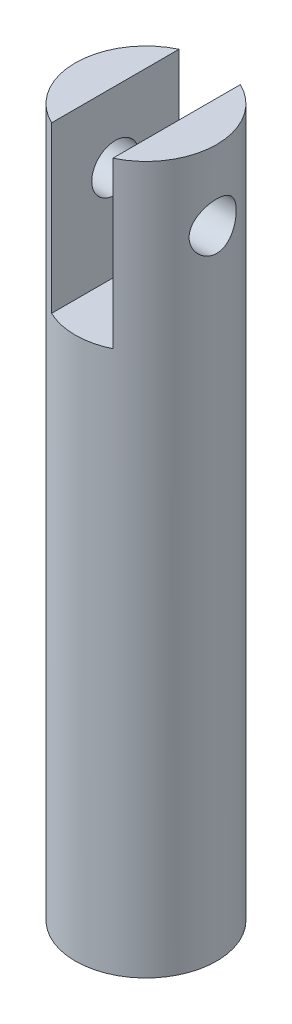
ISO-10303-21;
HEADER;
FILE_DESCRIPTION(('STEP AP214'),'2;1');
FILE_NAME('part.step','',(''),(''),'','','');
FILE_SCHEMA(('AUTOMOTIVE_DESIGN { 1 0 10303 214 1 1 1 1 }'));
ENDSEC;
DATA;
#1=APPLICATION_CONTEXT('core data for automotive mechanical design processes');
#2=APPLICATION_PROTOCOL_DEFINITION('international standard','automotive_design',2000,#1);
#3=PRODUCT_CONTEXT('',#1,'mechanical');
#4=PRODUCT('Part','Part','',(#3));
#5=PRODUCT_RELATED_PRODUCT_CATEGORY('part','',(#4));
#6=PRODUCT_DEFINITION_FORMATION('','',#4);
#7=PRODUCT_DEFINITION_CONTEXT('part definition',#1,'design');
#8=PRODUCT_DEFINITION('design','',#6,#7);
#9=PRODUCT_DEFINITION_SHAPE('','',#8);
#10=(LENGTH_UNIT() NAMED_UNIT(*) SI_UNIT(.MILLI.,.METRE.));
#11=(NAMED_UNIT(*) PLANE_ANGLE_UNIT() SI_UNIT($,.RADIAN.));
#12=(NAMED_UNIT(*) SI_UNIT($,.STERADIAN.) SOLID_ANGLE_UNIT());
#13=UNCERTAINTY_MEASURE_WITH_UNIT(LENGTH_MEASURE(1.E-05),#10,'distance_accuracy_value','');
#14=(GEOMETRIC_REPRESENTATION_CONTEXT(3) GLOBAL_UNCERTAINTY_ASSIGNED_CONTEXT((#13)) GLOBAL_UNIT_ASSIGNED_CONTEXT((#10,
#11,#12)) REPRESENTATION_CONTEXT('',''));
#15=CARTESIAN_POINT('',(0.,0.,0.));
#16=DIRECTION('',(0.,0.,1.));
#17=DIRECTION('',(1.,0.,0.));
#18=AXIS2_PLACEMENT_3D('',#15,#16,#17);
#19=CARTESIAN_POINT('',(0.,30.,0.));
#20=DIRECTION('',(0.,1.,0.));
#21=DIRECTION('',(0.,0.,1.));
#22=AXIS2_PLACEMENT_3D('',#19,#20,#21);
#23=PLANE('',#22);
#24=DIRECTION('',(0.,0.,-1.));
#25=VECTOR('',#24,1.);
#26=CARTESIAN_POINT('',(1.3,30.,0.));
#27=LINE('',#26,#25);
#28=CARTESIAN_POINT('',(1.3,30.,2.70370116691916));
#29=VERTEX_POINT('',#28);
#30=CARTESIAN_POINT('',(1.3,30.,-2.70370116691916));
#31=VERTEX_POINT('',#30);
#32=EDGE_CURVE('E91',#29,#31,#27,.T.);
#33=ORIENTED_EDGE('',*,*,#32,.F.);
#34=CARTESIAN_POINT('',(0.,30.,0.));
#35=DIRECTION('',(0.,1.,0.));
#36=DIRECTION('',(0.,0.,1.));
#37=AXIS2_PLACEMENT_3D('',#34,#35,#36);
#38=CIRCLE('',#37,3.);
#39=EDGE_CURVE('E92',#29,#31,#38,.T.);
#40=ORIENTED_EDGE('',*,*,#39,.T.);
#41=EDGE_LOOP('',(#33,#40));
#42=FACE_BOUND('',#41,.T.);
#43=ADVANCED_FACE('F39',(#42),#23,.T.);
#44=CARTESIAN_POINT('',(0.,30.,0.));
#45=DIRECTION('',(0.,-1.,0.));
#46=DIRECTION('',(0.,0.,-1.));
#47=AXIS2_PLACEMENT_3D('',#44,#45,#46);
#48=CYLINDRICAL_SURFACE('',#47,3.);
#49=CARTESIAN_POINT('',(3.,26.,0.));
#50=CARTESIAN_POINT('',(3.00000015300943,25.9999997462684,0.0545633628867233));
#51=CARTESIAN_POINT('',(2.99849769507545,26.0044802661272,0.10912519453855));
#52=CARTESIAN_POINT('',(2.99265210203281,26.0222291088172,0.216641760872972));
#53=CARTESIAN_POINT('',(2.98830867202153,26.0354983439489,0.269596328118818));
#54=CARTESIAN_POINT('',(2.97725307906443,26.0703192433841,0.372332789501777));
#55=CARTESIAN_POINT('',(2.97054487730853,26.0918570624593,0.422119825886036));
#56=CARTESIAN_POINT('',(2.95544445717342,26.1425411728383,0.517374936805327));
#57=CARTESIAN_POINT('',(2.94705190667778,26.1716889650026,0.562842156958708));
#58=CARTESIAN_POINT('',(2.92914094443005,26.2378258048588,0.649741675022268));
#59=CARTESIAN_POINT('',(2.91959556463785,26.2750312342605,0.691003700298311));
#60=CARTESIAN_POINT('',(2.90060314783121,26.3557671547066,0.766832692702085));
#61=CARTESIAN_POINT('',(2.89115613290549,26.3992990349285,0.801398185489463));
#62=CARTESIAN_POINT('',(2.87313332477274,26.4929851151965,0.86382494222786));
#63=CARTESIAN_POINT('',(2.86459039275688,26.5432937397321,0.891464858221033));
#64=CARTESIAN_POINT('',(2.84975305418601,26.6481760944585,0.937818873877722));
#65=CARTESIAN_POINT('',(2.84345796160746,26.7027485171627,0.956535697386766));
#66=CARTESIAN_POINT('',(2.83411303269377,26.8126732214967,0.983873461509164));
#67=CARTESIAN_POINT('',(2.83096095769611,26.8679372084891,0.992813448271769));
#68=CARTESIAN_POINT('',(2.82795656629508,26.9792637541559,1.00134112333448));
#69=CARTESIAN_POINT('',(2.8281032302273,27.0353260607092,1.00093170160472));
#70=CARTESIAN_POINT('',(2.8315901500818,27.143936630444,0.991019903703419));
#71=CARTESIAN_POINT('',(2.83478415867533,27.196528402919,0.981933913166994));
#72=CARTESIAN_POINT('',(2.84376657724551,27.2993934196068,0.955606162849416));
#73=CARTESIAN_POINT('',(2.84955529784108,27.3496663854351,0.93836342659187));
#74=CARTESIAN_POINT('',(2.86317911131249,27.4474127495915,0.89593905806021));
#75=CARTESIAN_POINT('',(2.87104565793117,27.4948280254695,0.870634048707261));
#76=CARTESIAN_POINT('',(2.88792558575726,27.5848709082797,0.812889106303137));
#77=CARTESIAN_POINT('',(2.89693929790464,27.6274971269334,0.780447112364003));
#78=CARTESIAN_POINT('',(2.91567329167741,27.7090915981608,0.707349332682236));
#79=CARTESIAN_POINT('',(2.92540589354843,27.7477526945091,0.666353150076311));
#80=CARTESIAN_POINT('',(2.94406938387037,27.8177312666634,0.578339569970065));
#81=CARTESIAN_POINT('',(2.95300019538067,27.8490480381645,0.531321595660815));
#82=CARTESIAN_POINT('',(2.96917107937794,27.9036963002351,0.431947613046267));
#83=CARTESIAN_POINT('',(2.9763935000804,27.9269454913407,0.379543276416336));
#84=CARTESIAN_POINT('',(2.98820567144435,27.9642031739557,0.271269083364506));
#85=CARTESIAN_POINT('',(2.99279633654879,27.9782148754234,0.215400438154952));
#86=CARTESIAN_POINT('',(2.99867627071441,27.9960556660224,0.104383829529301));
#87=CARTESIAN_POINT('',(3.00010001833731,28.0002998091727,0.0493095998648431));
#88=CARTESIAN_POINT('',(2.99988902694825,27.9996673264015,-0.0607750699602384));
#89=CARTESIAN_POINT('',(2.99825480419352,27.9947922400201,-0.115785519319649));
#90=CARTESIAN_POINT('',(2.99220024717114,27.976388092264,-0.222519866304261));
#91=CARTESIAN_POINT('',(2.98786198711228,27.9631137939505,-0.274292806834858));
#92=CARTESIAN_POINT('',(2.97691846830034,27.9286065555333,-0.374855958579562));
#93=CARTESIAN_POINT('',(2.97031292046541,27.9073726005323,-0.423645788508561));
#94=CARTESIAN_POINT('',(2.95528931287427,27.8569295681591,-0.518288296393324));
#95=CARTESIAN_POINT('',(2.94682814756305,27.8275254067164,-0.564029959217332));
#96=CARTESIAN_POINT('',(2.92905253915743,27.7618058499869,-0.650064830135406));
#97=CARTESIAN_POINT('',(2.91973783591888,27.7254883439698,-0.690356367794896));
#98=CARTESIAN_POINT('',(2.90076847982472,27.6450212489917,-0.766252507807015));
#99=CARTESIAN_POINT('',(2.89111761095155,27.6005907730668,-0.801560969248493));
#100=CARTESIAN_POINT('',(2.87299973286981,27.5062284321955,-0.864257522320856));
#101=CARTESIAN_POINT('',(2.8645327335312,27.4562965213898,-0.891645547920846));
#102=CARTESIAN_POINT('',(2.84982391820308,27.3523269846934,-0.937596930423362));
#103=CARTESIAN_POINT('',(2.84357760900632,27.2982979207572,-0.956178132197767));
#104=CARTESIAN_POINT('',(2.83410832399133,27.1876213498758,-0.983894666792164));
#105=CARTESIAN_POINT('',(2.83088398622698,27.1309750345669,-0.993034254961245));
#106=CARTESIAN_POINT('',(2.82797858875071,27.0198029039868,-1.00127628247038));
#107=CARTESIAN_POINT('',(2.82812400344299,26.9653176597483,-1.00087025731093));
#108=CARTESIAN_POINT('',(2.8315126992356,26.8572349251003,-0.991242293454879));
#109=CARTESIAN_POINT('',(2.83475579595884,26.8036373820471,-0.982020879458888));
#110=CARTESIAN_POINT('',(2.84384524278943,26.6998643369873,-0.955371813126982));
#111=CARTESIAN_POINT('',(2.84964098015514,26.6496431749928,-0.938103346014882));
#112=CARTESIAN_POINT('',(2.86316398825434,26.5527725930645,-0.895979365760384));
#113=CARTESIAN_POINT('',(2.87089168765297,26.5061239688127,-0.871122168553981));
#114=CARTESIAN_POINT('',(2.8878282922406,26.4155163300763,-0.81326069258325));
#115=CARTESIAN_POINT('',(2.89708711641604,26.3717634981014,-0.779948242764534));
#116=CARTESIAN_POINT('',(2.91583356283786,26.290310186616,-0.7066428831357));
#117=CARTESIAN_POINT('',(2.92532124912518,26.252611424312,-0.666648084451497));
#118=CARTESIAN_POINT('',(2.94390030525393,26.1828555877108,-0.579241556920676));
#119=CARTESIAN_POINT('',(2.95296181801216,26.151075652249,-0.531601513499725));
#120=CARTESIAN_POINT('',(2.96925991172653,26.0960095711494,-0.431357357406627));
#121=CARTESIAN_POINT('',(2.97649695907941,26.072721254078,-0.378754518132348));
#122=CARTESIAN_POINT('',(2.98805515068532,26.0362783675113,-0.272493647200974));
#123=CARTESIAN_POINT('',(2.9924921242252,26.0227175337366,-0.218987757676408));
#124=CARTESIAN_POINT('',(2.99846407064225,26.0045797193229,-0.110320416010247));
#125=CARTESIAN_POINT('',(2.99999984531906,26.0000002565035,-0.0551594255687464));
#126=CARTESIAN_POINT('',(3.,26.,0.));
#127=B_SPLINE_CURVE_WITH_KNOTS('',3,(#49,#50,#51,#52,#53,#54,#55,#56,#57,#58,#59,#60,#61,#62,
#63,#64,#65,#66,#67,#68,#69,#70,#71,#72,#73,#74,#75,#76,#77,#78,#79,#80,#81,#82,#83,#84,#85,#86,
#87,#88,#89,#90,#91,#92,#93,#94,#95,#96,#97,#98,#99,#100,#101,#102,#103,#104,#105,#106,#107,
#108,#109,#110,#111,#112,#113,#114,#115,#116,#117,#118,#119,#120,#121,#122,#123,#124,#125,#126),
.UNSPECIFIED.,.T.,.F.,(4,2,2,2,2,2,2,2,2,2,2,2,2,2,2,2,2,2,2,2,2,2,2,2,2,2,2,2,2,2,2,2,2,2,2,2,
2,2,4),(0.,0.163487106026011,0.326991185267521,0.490222672870276,0.653486377799102,
0.821846842827564,0.990244332875303,1.16348384823471,1.33667044692834,1.5040192574184,
1.67131633987486,1.83096826551281,1.99063930855483,2.15288171155131,2.31517102558207,
2.48593305811367,2.65671145966618,2.82918405650358,3.00159668877209,3.1665358317517,
3.33144713164177,3.49158157978214,3.65173645284104,3.81610399843737,3.98052180821891,
4.15241022880752,4.32430008234997,4.49584013824417,4.66730284700846,4.82995666056619,
4.99260079341185,5.15215587070228,5.31174638165788,5.47830066681615,5.64490211113589,
5.81799660824911,5.99104681142267,6.15636558363624,6.3216386602795),.UNSPECIFIED.);
#128=CARTESIAN_POINT('',(3.,26.,0.));
#129=VERTEX_POINT('',#128);
#130=EDGE_CURVE('E124',#129,#129,#127,.T.);
#131=ORIENTED_EDGE('',*,*,#130,.T.);
#132=EDGE_LOOP('',(#131));
#133=FACE_BOUND('',#132,.T.);
#134=CARTESIAN_POINT('',(-2.82842712474619,27.,1.));
#135=CARTESIAN_POINT('',(-2.82842694532735,26.9455318251893,1.0000002579478));
#136=CARTESIAN_POINT('',(-2.83001769372806,26.8910652002285,0.99553478369814));
#137=CARTESIAN_POINT('',(-2.8361757417458,26.7837455790494,0.977851131702564));
#138=CARTESIAN_POINT('',(-2.8407435316722,26.7308928501361,0.964631512170673));
#139=CARTESIAN_POINT('',(-2.85228203663888,26.6283731069872,0.929955485680262));
#140=CARTESIAN_POINT('',(-2.8592480396464,26.5787000705531,0.908515221401999));
#141=CARTESIAN_POINT('',(-2.87479122017008,26.4836399514562,0.858061628442625));
#142=CARTESIAN_POINT('',(-2.88336875305432,26.4382538174475,0.829046628860521));
#143=CARTESIAN_POINT('',(-2.90154489405589,26.3512800376605,0.763051146442525));
#144=CARTESIAN_POINT('',(-2.91116894844139,26.309884571328,0.725824341377823));
#145=CARTESIAN_POINT('',(-2.93013864801509,26.2337931987757,0.644987667214488));
#146=CARTESIAN_POINT('',(-2.93948424829099,26.1990983684177,0.6013767750524));
#147=CARTESIAN_POINT('',(-2.95713866921658,26.1365211026703,0.507604507964983));
#148=CARTESIAN_POINT('',(-2.96541407701568,26.108840029382,0.457301911224517));
#149=CARTESIAN_POINT('',(-2.97969586771021,26.0624084148725,0.352431222987479));
#150=CARTESIAN_POINT('',(-2.98570286203012,26.0436554668231,0.297864285687212));
#151=CARTESIAN_POINT('',(-2.99459075431897,26.0162641453676,0.18802881743349));
#152=CARTESIAN_POINT('',(-2.99757314777558,26.007296553743,0.132850754852965));
#153=CARTESIAN_POINT('',(-3.00043608218249,25.9986837066393,0.0216978748240891));
#154=CARTESIAN_POINT('',(-3.00031742262891,25.9990360483476,-0.0342767335438948));
#155=CARTESIAN_POINT('',(-2.99706039618736,26.008844254566,-0.143103515193819));
#156=CARTESIAN_POINT('',(-2.99404064755135,26.0179425284745,-0.195992048591669));
#157=CARTESIAN_POINT('',(-2.98546967339714,26.0443929809805,-0.299443438822162));
#158=CARTESIAN_POINT('',(-2.97991827631115,26.0617457189798,-0.350006137779177));
#159=CARTESIAN_POINT('',(-2.96675670293292,26.1044213173061,-0.448152474842016));
#160=CARTESIAN_POINT('',(-2.9591204252427,26.1298459385468,-0.495688220969));
#161=CARTESIAN_POINT('',(-2.94258393038665,26.1878597054484,-0.585924325527172));
#162=CARTESIAN_POINT('',(-2.93368336200518,26.2204508433266,-0.628623334384772));
#163=CARTESIAN_POINT('',(-2.9150619185089,26.2936743934607,-0.710100866551909));
#164=CARTESIAN_POINT('',(-2.90532215172667,26.3346131578454,-0.748600157067557));
#165=CARTESIAN_POINT('',(-2.88647335245111,26.4224487257227,-0.81827725959589));
#166=CARTESIAN_POINT('',(-2.8773644173145,26.4693464457132,-0.849453943273006));
#167=CARTESIAN_POINT('',(-2.86070525135531,26.5686536256154,-0.903987455042734));
#168=CARTESIAN_POINT('',(-2.85317909338821,26.6211321313678,-0.927226463651051));
#169=CARTESIAN_POINT('',(-2.84081650878299,26.7295713942663,-0.964443193299509));
#170=CARTESIAN_POINT('',(-2.83597895501223,26.7855306812218,-0.978424795755531));
#171=CARTESIAN_POINT('',(-2.8297963630207,26.8966383554006,-0.996161282090475));
#172=CARTESIAN_POINT('',(-2.82830360315139,26.9517094247457,-1.00034909550575));
#173=CARTESIAN_POINT('',(-2.828566720628,27.061776149117,-0.999605438911606));
#174=CARTESIAN_POINT('',(-2.83032200792768,27.1167718160248,-0.994675625227261));
#175=CARTESIAN_POINT('',(-2.83673618089379,27.2231569657112,-0.976225651551831));
#176=CARTESIAN_POINT('',(-2.84129325440593,27.2746054301506,-0.963006393980556));
#177=CARTESIAN_POINT('',(-2.8526855367127,27.3745436062394,-0.928713862560597));
#178=CARTESIAN_POINT('',(-2.85952114934907,27.4230327915908,-0.907639196363458));
#179=CARTESIAN_POINT('',(-2.87496877595718,27.5173804208469,-0.857474340738902));
#180=CARTESIAN_POINT('',(-2.8836302566561,27.5631066426418,-0.828151118358488));
#181=CARTESIAN_POINT('',(-2.90165768730984,27.6491460523837,-0.762585630557569));
#182=CARTESIAN_POINT('',(-2.91102384443799,27.6894576386612,-0.726341325498785));
#183=CARTESIAN_POINT('',(-2.92995038637844,27.7655279840906,-0.645891705900322));
#184=CARTESIAN_POINT('',(-2.93949843577895,27.8009743900189,-0.601387270546652));
#185=CARTESIAN_POINT('',(-2.9572685161311,27.863916142348,-0.506827291400258));
#186=CARTESIAN_POINT('',(-2.96549059417695,27.8914117711624,-0.456771944864552));
#187=CARTESIAN_POINT('',(-2.97964405810603,27.9374201048617,-0.352779862432295));
#188=CARTESIAN_POINT('',(-2.98559030004531,27.9559912771481,-0.298871123321196));
#189=CARTESIAN_POINT('',(-2.99458610837774,27.9837277420601,-0.188458465846016));
#190=CARTESIAN_POINT('',(-2.99763672034018,27.9928964298805,-0.131955491953889));
#191=CARTESIAN_POINT('',(-3.00041863236257,28.0012620776056,-0.0208153358600405));
#192=CARTESIAN_POINT('',(-3.00029920089441,28.0009074539324,0.033784723920019));
#193=CARTESIAN_POINT('',(-2.99712196519396,27.9913426918536,0.142111145000174));
#194=CARTESIAN_POINT('',(-2.99406439933567,27.9821332718472,0.195837576819056));
#195=CARTESIAN_POINT('',(-2.98540914954421,27.955417765424,0.300042119432061));
#196=CARTESIAN_POINT('',(-2.9798525836118,27.938045784647,0.350558270912795));
#197=CARTESIAN_POINT('',(-2.96677160704464,27.8956224689029,0.44797835093979));
#198=CARTESIAN_POINT('',(-2.95924684047901,27.8705697448031,0.49488162414241));
#199=CARTESIAN_POINT('',(-2.94265868828001,27.8124304878979,0.58563401630881));
#200=CARTESIAN_POINT('',(-2.93354872492381,27.7790813146181,0.629306251557697));
#201=CARTESIAN_POINT('',(-2.91492988791425,27.7057426088441,0.710581026272338));
#202=CARTESIAN_POINT('',(-2.90542088771397,27.6657509577383,0.748181621624259));
#203=CARTESIAN_POINT('',(-2.88663279827365,27.578390644412,0.817741808833465));
#204=CARTESIAN_POINT('',(-2.87737727995345,27.5307944890192,0.849422965999217));
#205=CARTESIAN_POINT('',(-2.86060193316303,27.4306655731013,0.904314343299799));
#206=CARTESIAN_POINT('',(-2.8530816513617,27.3781341069858,0.927526776814558));
#207=CARTESIAN_POINT('',(-2.84101334230535,27.2720381759762,0.963843828206626));
#208=CARTESIAN_POINT('',(-2.83634632944799,27.2186277364343,0.977357909163268));
#209=CARTESIAN_POINT('',(-2.8300538361394,27.1101439494845,0.995434320161694));
#210=CARTESIAN_POINT('',(-2.82842730615135,27.0550711825643,0.999999739196502));
#211=CARTESIAN_POINT('',(-2.82842712474619,27.,1.));
#212=B_SPLINE_CURVE_WITH_KNOTS('',3,(#134,#135,#136,#137,#138,#139,#140,#141,#142,#143,#144,
#145,#146,#147,#148,#149,#150,#151,#152,#153,#154,#155,#156,#157,#158,#159,#160,#161,#162,#163,
#164,#165,#166,#167,#168,#169,#170,#171,#172,#173,#174,#175,#176,#177,#178,#179,#180,#181,#182,
#183,#184,#185,#186,#187,#188,#189,#190,#191,#192,#193,#194,#195,#196,#197,#198,#199,#200,#201,
#202,#203,#204,#205,#206,#207,#208,#209,#210,#211),.UNSPECIFIED.,.T.,.F.,(4,2,2,2,2,2,2,2,2,2,2,
2,2,2,2,2,2,2,2,2,2,2,2,2,2,2,2,2,2,2,2,2,2,2,2,2,2,2,4),(0.,0.163200584775416,
0.326428054968882,0.489336627454547,0.652281166139164,0.8210133742294,0.989772651673598,
1.16293506139029,1.33605076382161,1.50314318760306,1.67019253297699,1.83069004820941,
1.99119844184608,2.15381654855707,2.31647991869394,2.48680174359289,2.65714979607478,
2.82992639837376,3.00263051349689,3.16754291357513,3.33242535830307,3.49164395761849,
3.65089079140019,3.81518857728788,3.97953485655201,4.15178808164166,4.32403518750605,
4.49513791183925,4.6661788299723,4.82918084670708,4.99216964002854,5.15256956033503,
5.31299850756316,5.47935519513707,5.64576504425705,5.81868902729218,5.99156778259939,
6.15663212153686,6.3216394717923),.UNSPECIFIED.);
#213=CARTESIAN_POINT('',(-2.82842712474619,27.,1.));
#214=VERTEX_POINT('',#213);
#215=EDGE_CURVE('E173',#214,#214,#212,.T.);
#216=ORIENTED_EDGE('',*,*,#215,.T.);
#217=EDGE_LOOP('',(#216));
#218=FACE_BOUND('',#217,.T.);
#219=ORIENTED_EDGE('',*,*,#39,.F.);
#220=DIRECTION('',(0.,-1.,0.));
#221=VECTOR('',#220,1.);
#222=CARTESIAN_POINT('',(1.3,30.,2.70370116691916));
#223=LINE('',#222,#221);
#224=CARTESIAN_POINT('',(1.3,23.,2.70370116691916));
#225=VERTEX_POINT('',#224);
#226=EDGE_CURVE('E110',#29,#225,#223,.T.);
#227=ORIENTED_EDGE('',*,*,#226,.T.);
#228=CARTESIAN_POINT('',(0.,23.,0.));
#229=DIRECTION('',(0.,-1.,0.));
#230=DIRECTION('',(0.,0.,-1.));
#231=AXIS2_PLACEMENT_3D('',#228,#229,#230);
#232=CIRCLE('',#231,3.);
#233=CARTESIAN_POINT('',(-1.3,23.,2.70370116691916));
#234=VERTEX_POINT('',#233);
#235=EDGE_CURVE('E11',#225,#234,#232,.T.);
#236=ORIENTED_EDGE('',*,*,#235,.T.);
#237=DIRECTION('',(0.,-1.,0.));
#238=VECTOR('',#237,1.);
#239=CARTESIAN_POINT('',(-1.3,30.,2.70370116691916));
#240=LINE('',#239,#238);
#241=CARTESIAN_POINT('',(-1.3,30.,2.70370116691916));
#242=VERTEX_POINT('',#241);
#243=EDGE_CURVE('E85',#234,#242,#240,.F.);
#244=ORIENTED_EDGE('',*,*,#243,.T.);
#245=CARTESIAN_POINT('',(-1.3,30.,-2.70370116691916));
#246=VERTEX_POINT('',#245);
#247=EDGE_CURVE('E97',#246,#242,#38,.T.);
#248=ORIENTED_EDGE('',*,*,#247,.F.);
#249=DIRECTION('',(0.,-1.,0.));
#250=VECTOR('',#249,1.);
#251=CARTESIAN_POINT('',(-1.3,30.,-2.70370116691916));
#252=LINE('',#251,#250);
#253=CARTESIAN_POINT('',(-1.3,23.,-2.70370116691916));
#254=VERTEX_POINT('',#253);
#255=EDGE_CURVE('E57',#246,#254,#252,.T.);
#256=ORIENTED_EDGE('',*,*,#255,.T.);
#257=CARTESIAN_POINT('',(1.3,23.,-2.70370116691916));
#258=VERTEX_POINT('',#257);
#259=EDGE_CURVE('E50',#254,#258,#232,.T.);
#260=ORIENTED_EDGE('',*,*,#259,.T.);
#261=DIRECTION('',(0.,-1.,0.));
#262=VECTOR('',#261,1.);
#263=CARTESIAN_POINT('',(1.3,30.,-2.70370116691916));
#264=LINE('',#263,#262);
#265=EDGE_CURVE('E65',#258,#31,#264,.F.);
#266=ORIENTED_EDGE('',*,*,#265,.T.);
#267=EDGE_LOOP('',(#219,#227,#236,#244,#248,#256,#260,#266));
#268=FACE_BOUND('',#267,.T.);
#269=CARTESIAN_POINT('',(0.,0.,0.));
#270=DIRECTION('',(0.,1.,0.));
#271=DIRECTION('',(0.,0.,1.));
#272=AXIS2_PLACEMENT_3D('',#269,#270,#271);
#273=CIRCLE('',#272,3.);
#274=CARTESIAN_POINT('',(0.,0.,3.));
#275=VERTEX_POINT('',#274);
#276=EDGE_CURVE('E104',#275,#275,#273,.T.);
#277=ORIENTED_EDGE('',*,*,#276,.T.);
#278=EDGE_LOOP('',(#277));
#279=FACE_BOUND('',#278,.T.);
#280=ADVANCED_FACE('F41',(#133,#218,#268,#279),#48,.T.);
#281=DIRECTION('',(0.,0.,1.));
#282=VECTOR('',#281,1.);
#283=CARTESIAN_POINT('',(-1.3,30.,0.));
#284=LINE('',#283,#282);
#285=EDGE_CURVE('E82',#246,#242,#284,.T.);
#286=ORIENTED_EDGE('',*,*,#285,.F.);
#287=ORIENTED_EDGE('',*,*,#247,.T.);
#288=EDGE_LOOP('',(#286,#287));
#289=FACE_BOUND('',#288,.T.);
#290=ADVANCED_FACE('F102',(#289),#23,.T.);
#291=CARTESIAN_POINT('',(0.,0.,0.));
#292=DIRECTION('',(0.,1.,0.));
#293=DIRECTION('',(0.,0.,1.));
#294=AXIS2_PLACEMENT_3D('',#291,#292,#293);
#295=PLANE('',#294);
#296=ORIENTED_EDGE('',*,*,#276,.F.);
#297=EDGE_LOOP('',(#296));
#298=FACE_BOUND('',#297,.T.);
#299=ADVANCED_FACE('F142',(#298),#295,.F.);
#300=CARTESIAN_POINT('',(0.,23.,0.));
#301=DIRECTION('',(0.,-1.,0.));
#302=DIRECTION('',(0.,0.,-1.));
#303=AXIS2_PLACEMENT_3D('',#300,#301,#302);
#304=PLANE('',#303);
#305=DIRECTION('',(0.,0.,-1.));
#306=VECTOR('',#305,1.);
#307=CARTESIAN_POINT('',(1.3,23.,3.10882948695928));
#308=LINE('',#307,#306);
#309=EDGE_CURVE('E120',#225,#258,#308,.T.);
#310=ORIENTED_EDGE('',*,*,#309,.T.);
#311=ORIENTED_EDGE('',*,*,#259,.F.);
#312=DIRECTION('',(0.,0.,1.));
#313=VECTOR('',#312,1.);
#314=CARTESIAN_POINT('',(-1.3,23.,3.10882948695928));
#315=LINE('',#314,#313);
#316=EDGE_CURVE('E100',#254,#234,#315,.T.);
#317=ORIENTED_EDGE('',*,*,#316,.T.);
#318=ORIENTED_EDGE('',*,*,#235,.F.);
#319=EDGE_LOOP('',(#310,#311,#317,#318));
#320=FACE_BOUND('',#319,.T.);
#321=ADVANCED_FACE('F119',(#320),#304,.F.);
#322=CARTESIAN_POINT('',(1.3,23.,3.10882948695928));
#323=DIRECTION('',(1.,0.,0.));
#324=DIRECTION('',(0.,0.,-1.));
#325=AXIS2_PLACEMENT_3D('',#322,#323,#324);
#326=PLANE('',#325);
#327=CARTESIAN_POINT('',(1.3,27.,0.));
#328=DIRECTION('',(1.,0.,0.));
#329=DIRECTION('',(0.,0.,-1.));
#330=AXIS2_PLACEMENT_3D('',#327,#328,#329);
#331=CIRCLE('',#330,1.);
#332=CARTESIAN_POINT('',(1.3,27.,-1.));
#333=VERTEX_POINT('',#332);
#334=EDGE_CURVE('E170',#333,#333,#331,.T.);
#335=ORIENTED_EDGE('',*,*,#334,.T.);
#336=EDGE_LOOP('',(#335));
#337=FACE_BOUND('',#336,.T.);
#338=ORIENTED_EDGE('',*,*,#32,.T.);
#339=ORIENTED_EDGE('',*,*,#265,.F.);
#340=ORIENTED_EDGE('',*,*,#309,.F.);
#341=ORIENTED_EDGE('',*,*,#226,.F.);
#342=EDGE_LOOP('',(#338,#339,#340,#341));
#343=FACE_BOUND('',#342,.T.);
#344=ADVANCED_FACE('F132',(#337,#343),#326,.F.);
#345=CARTESIAN_POINT('',(-1.3,23.,3.10882948695928));
#346=DIRECTION('',(-1.,0.,0.));
#347=DIRECTION('',(0.,0.,1.));
#348=AXIS2_PLACEMENT_3D('',#345,#346,#347);
#349=PLANE('',#348);
#350=CARTESIAN_POINT('',(-1.3,27.,0.));
#351=DIRECTION('',(-1.,0.,0.));
#352=DIRECTION('',(0.,0.,1.));
#353=AXIS2_PLACEMENT_3D('',#350,#351,#352);
#354=CIRCLE('',#353,1.);
#355=CARTESIAN_POINT('',(-1.3,27.,1.));
#356=VERTEX_POINT('',#355);
#357=EDGE_CURVE('E44',#356,#356,#354,.T.);
#358=ORIENTED_EDGE('',*,*,#357,.T.);
#359=EDGE_LOOP('',(#358));
#360=FACE_BOUND('',#359,.T.);
#361=ORIENTED_EDGE('',*,*,#285,.T.);
#362=ORIENTED_EDGE('',*,*,#243,.F.);
#363=ORIENTED_EDGE('',*,*,#316,.F.);
#364=ORIENTED_EDGE('',*,*,#255,.F.);
#365=EDGE_LOOP('',(#361,#362,#363,#364));
#366=FACE_BOUND('',#365,.T.);
#367=ADVANCED_FACE('F84',(#360,#366),#349,.F.);
#368=CARTESIAN_POINT('',(3.,27.,0.));
#369=DIRECTION('',(-1.,0.,0.));
#370=DIRECTION('',(0.,0.,1.));
#371=AXIS2_PLACEMENT_3D('',#368,#369,#370);
#372=CYLINDRICAL_SURFACE('',#371,1.);
#373=ORIENTED_EDGE('',*,*,#357,.F.);
#374=EDGE_LOOP('',(#373));
#375=FACE_BOUND('',#374,.T.);
#376=ORIENTED_EDGE('',*,*,#215,.F.);
#377=EDGE_LOOP('',(#376));
#378=FACE_BOUND('',#377,.T.);
#379=ADVANCED_FACE('F161',(#375,#378),#372,.F.);
#380=ORIENTED_EDGE('',*,*,#334,.F.);
#381=EDGE_LOOP('',(#380));
#382=FACE_BOUND('',#381,.T.);
#383=ORIENTED_EDGE('',*,*,#130,.F.);
#384=EDGE_LOOP('',(#383));
#385=FACE_BOUND('',#384,.T.);
#386=ADVANCED_FACE('F158',(#382,#385),#372,.F.);
#387=CLOSED_SHELL('',(#43,#280,#290,#299,#321,#344,#367,#379,#386));
#388=MANIFOLD_SOLID_BREP('B2',#387);
#389=ADVANCED_BREP_SHAPE_REPRESENTATION('',(#18,#388),#14);
#390=SHAPE_DEFINITION_REPRESENTATION(#9,#389);
ENDSEC;
END-ISO-10303-21;
